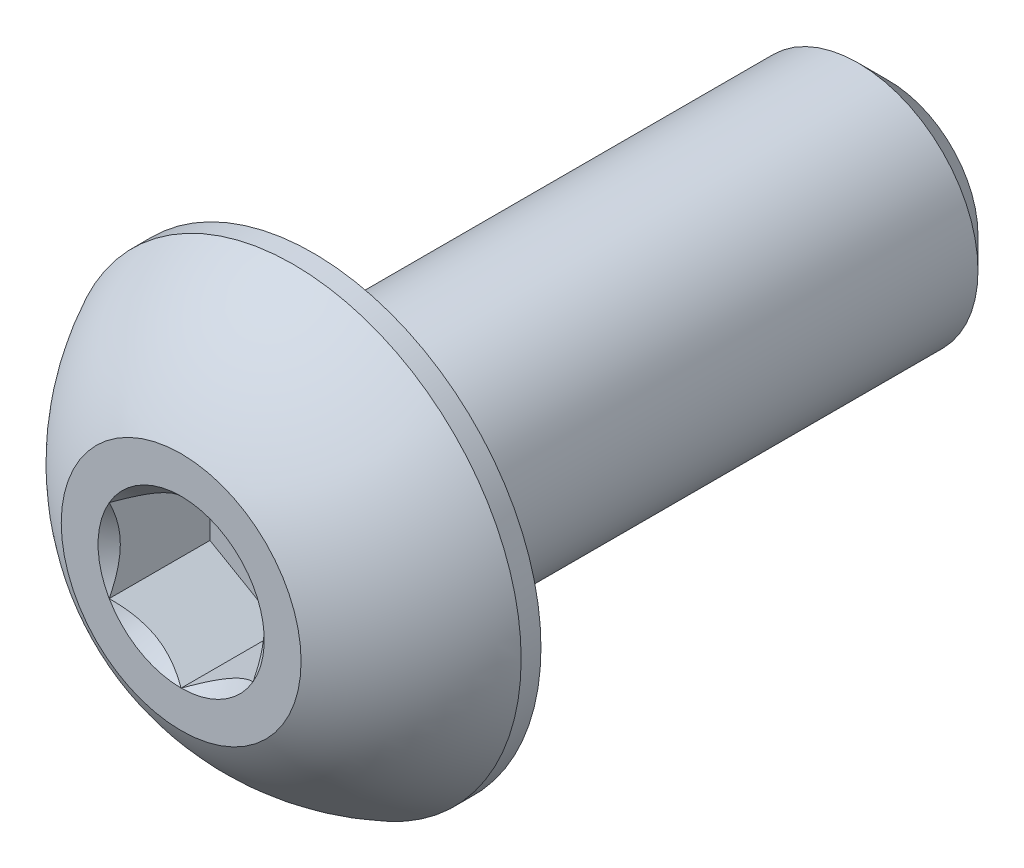
ISO-10303-21;
HEADER;
FILE_DESCRIPTION(('STEP AP214'),'2;1');
FILE_NAME('part.step','',(''),(''),'','','');
FILE_SCHEMA(('AUTOMOTIVE_DESIGN { 1 0 10303 214 1 1 1 1 }'));
ENDSEC;
DATA;
#1=APPLICATION_CONTEXT('core data for automotive mechanical design processes');
#2=APPLICATION_PROTOCOL_DEFINITION('international standard','automotive_design',2000,#1);
#3=PRODUCT_CONTEXT('',#1,'mechanical');
#4=PRODUCT('Part','Part','',(#3));
#5=PRODUCT_RELATED_PRODUCT_CATEGORY('part','',(#4));
#6=PRODUCT_DEFINITION_FORMATION('','',#4);
#7=PRODUCT_DEFINITION_CONTEXT('part definition',#1,'design');
#8=PRODUCT_DEFINITION('design','',#6,#7);
#9=PRODUCT_DEFINITION_SHAPE('','',#8);
#10=(LENGTH_UNIT() NAMED_UNIT(*) SI_UNIT(.MILLI.,.METRE.));
#11=(NAMED_UNIT(*) PLANE_ANGLE_UNIT() SI_UNIT($,.RADIAN.));
#12=(NAMED_UNIT(*) SI_UNIT($,.STERADIAN.) SOLID_ANGLE_UNIT());
#13=UNCERTAINTY_MEASURE_WITH_UNIT(LENGTH_MEASURE(1.E-05),#10,'distance_accuracy_value','');
#14=(GEOMETRIC_REPRESENTATION_CONTEXT(3) GLOBAL_UNCERTAINTY_ASSIGNED_CONTEXT((#13)) GLOBAL_UNIT_ASSIGNED_CONTEXT((#10,
#11,#12)) REPRESENTATION_CONTEXT('',''));
#15=CARTESIAN_POINT('',(0.,0.,0.));
#16=DIRECTION('',(0.,0.,1.));
#17=DIRECTION('',(1.,0.,0.));
#18=AXIS2_PLACEMENT_3D('',#15,#16,#17);
#19=CARTESIAN_POINT('',(0.,0.,7.375));
#20=DIRECTION('',(0.,0.,-1.));
#21=DIRECTION('',(-1.,0.,0.));
#22=AXIS2_PLACEMENT_3D('',#19,#20,#21);
#23=PLANE('',#22);
#24=CARTESIAN_POINT('',(0.,0.,7.375));
#25=DIRECTION('',(0.,0.,1.));
#26=DIRECTION('',(1.,0.,0.));
#27=AXIS2_PLACEMENT_3D('',#24,#25,#26);
#28=CIRCLE('',#27,1.73205080756888);
#29=CARTESIAN_POINT('',(-1.5,0.866025403784439,7.375));
#30=VERTEX_POINT('',#29);
#31=CARTESIAN_POINT('',(-1.5,-0.866025403784439,7.375));
#32=VERTEX_POINT('',#31);
#33=EDGE_CURVE('E131',#30,#32,#28,.T.);
#34=ORIENTED_EDGE('',*,*,#33,.F.);
#35=CARTESIAN_POINT('',(0.,1.73205080756888,7.375));
#36=VERTEX_POINT('',#35);
#37=EDGE_CURVE('E104',#36,#30,#28,.T.);
#38=ORIENTED_EDGE('',*,*,#37,.F.);
#39=CARTESIAN_POINT('',(1.5,0.866025403784439,7.375));
#40=VERTEX_POINT('',#39);
#41=EDGE_CURVE('E93',#40,#36,#28,.T.);
#42=ORIENTED_EDGE('',*,*,#41,.F.);
#43=CARTESIAN_POINT('',(1.5,-0.866025403784439,7.375));
#44=VERTEX_POINT('',#43);
#45=EDGE_CURVE('E57',#44,#40,#28,.T.);
#46=ORIENTED_EDGE('',*,*,#45,.F.);
#47=CARTESIAN_POINT('',(0.,-1.73205080756888,7.375));
#48=VERTEX_POINT('',#47);
#49=EDGE_CURVE('E62',#48,#44,#28,.T.);
#50=ORIENTED_EDGE('',*,*,#49,.F.);
#51=EDGE_CURVE('E135',#32,#48,#28,.T.);
#52=ORIENTED_EDGE('',*,*,#51,.F.);
#53=EDGE_LOOP('',(#34,#38,#42,#46,#50,#52));
#54=FACE_BOUND('',#53,.T.);
#55=CARTESIAN_POINT('',(0.,0.,7.375));
#56=DIRECTION('',(0.,0.,1.));
#57=DIRECTION('',(1.,0.,0.));
#58=AXIS2_PLACEMENT_3D('',#55,#56,#57);
#59=CIRCLE('',#58,2.5);
#60=CARTESIAN_POINT('',(0.,2.5,7.375));
#61=VERTEX_POINT('',#60);
#62=EDGE_CURVE('E49',#61,#61,#59,.T.);
#63=ORIENTED_EDGE('',*,*,#62,.T.);
#64=EDGE_LOOP('',(#63));
#65=FACE_BOUND('',#64,.T.);
#66=ADVANCED_FACE('F40',(#54,#65),#23,.F.);
#67=CARTESIAN_POINT('',(0.,0.,2.71694518716577));
#68=DIRECTION('',(0.,0.,1.));
#69=DIRECTION('',(0.,1.,0.));
#70=AXIS2_PLACEMENT_3D('',#67,#68,#69);
#71=SPHERICAL_SURFACE('',#70,5.28653711226622);
#72=CARTESIAN_POINT('',(0.,0.,5.0375));
#73=DIRECTION('',(0.,0.,1.));
#74=DIRECTION('',(1.,0.,0.));
#75=AXIS2_PLACEMENT_3D('',#72,#73,#74);
#76=CIRCLE('',#75,4.75);
#77=CARTESIAN_POINT('',(0.,4.75,5.0375));
#78=VERTEX_POINT('',#77);
#79=EDGE_CURVE('E211',#78,#78,#76,.T.);
#80=CARTESIAN_POINT('',(0.,2.5,7.375));
#81=CARTESIAN_POINT('',(0.,2.53026679982017,7.35875571754439));
#82=CARTESIAN_POINT('',(0.,2.56037522904968,7.34221635879359));
#83=CARTESIAN_POINT('',(0.,2.62026400427657,7.30855394811781));
#84=CARTESIAN_POINT('',(0.,2.65004435027396,7.29143089619284));
#85=CARTESIAN_POINT('',(0.,2.70926561698583,7.25660755858496));
#86=CARTESIAN_POINT('',(0.,2.73870653770032,7.23890727290205));
#87=CARTESIAN_POINT('',(0.,2.79723777417103,7.20293620595506));
#88=CARTESIAN_POINT('',(0.,2.82632808992726,7.18466542469097));
#89=CARTESIAN_POINT('',(0.,2.88414706107589,7.14756030560732));
#90=CARTESIAN_POINT('',(0.,2.91287571646831,7.12872596778776));
#91=CARTESIAN_POINT('',(0.,2.96996045130293,7.09050089302141));
#92=CARTESIAN_POINT('',(0.,2.99831653074515,7.07111015607464));
#93=CARTESIAN_POINT('',(0.,3.05464533901891,7.03177965075515));
#94=CARTESIAN_POINT('',(0.,3.08261806785047,7.01183988238243));
#95=CARTESIAN_POINT('',(0.,3.13816954607726,6.97141889083541));
#96=CARTESIAN_POINT('',(0.,3.16574829547251,6.9509376676611));
#97=CARTESIAN_POINT('',(0.,3.22050133565615,6.90944154879096));
#98=CARTESIAN_POINT('',(0.,3.24767562644455,6.88842665309514));
#99=CARTESIAN_POINT('',(0.,3.30160942393942,6.84587117426481));
#100=CARTESIAN_POINT('',(0.,3.32836893064588,6.82433059113032));
#101=CARTESIAN_POINT('',(0.,3.38146299210494,6.78073192224629));
#102=CARTESIAN_POINT('',(0.,3.40779754685753,6.75867383649675));
#103=CARTESIAN_POINT('',(0.,3.46003169800773,6.71404854384449));
#104=CARTESIAN_POINT('',(0.,3.48593129440535,6.69148133694176));
#105=CARTESIAN_POINT('',(0.,3.53728568771641,6.64584637689649));
#106=CARTESIAN_POINT('',(0.,3.56274048462986,6.62277862375395));
#107=CARTESIAN_POINT('',(0.,3.61319560685493,6.57615133633622));
#108=CARTESIAN_POINT('',(0.,3.63819593216655,6.55259180206104));
#109=CARTESIAN_POINT('',(0.,3.68773261175691,6.50498990434842));
#110=CARTESIAN_POINT('',(0.,3.71226896603565,6.48094754091097));
#111=CARTESIAN_POINT('',(0.,3.76086838042534,6.43238912030588));
#112=CARTESIAN_POINT('',(0.,3.78493144053629,6.40787306313824));
#113=CARTESIAN_POINT('',(0.,3.83257512329416,6.35837657049534));
#114=CARTESIAN_POINT('',(0.,3.85615574594108,6.33339613502008));
#115=CARTESIAN_POINT('',(0.,3.90282559378753,6.2829803776354));
#116=CARTESIAN_POINT('',(0.,3.92591481898706,6.25754505572599));
#117=CARTESIAN_POINT('',(0.,3.97159309867276,6.2062291901907));
#118=CARTESIAN_POINT('',(0.,3.99418215315894,6.18034864656483));
#119=CARTESIAN_POINT('',(0.,4.03885150820303,6.12815217148627));
#120=CARTESIAN_POINT('',(0.,4.06093180876093,6.10183624003357));
#121=CARTESIAN_POINT('',(0.,4.10457526604591,6.04877898862629));
#122=CARTESIAN_POINT('',(0.,4.12613842277298,6.0220376686717));
#123=CARTESIAN_POINT('',(0.,4.16873939899417,5.96813980122146));
#124=CARTESIAN_POINT('',(0.,4.1897772184883,5.9409832537258));
#125=CARTESIAN_POINT('',(0.,4.23131952645464,5.886265249929));
#126=CARTESIAN_POINT('',(0.,4.25182401492686,5.85870379362786));
#127=CARTESIAN_POINT('',(0.,4.29229186971308,5.8031864448106));
#128=CARTESIAN_POINT('',(0.,4.31225523602708,5.77523055229449));
#129=CARTESIAN_POINT('',(0.,4.35163326096594,5.71893495350959));
#130=CARTESIAN_POINT('',(0.,4.3710479195908,5.6905952472408));
#131=CARTESIAN_POINT('',(0.,4.40932115213664,5.63354278926291));
#132=CARTESIAN_POINT('',(0.,4.42817972605762,5.60483003755382));
#133=CARTESIAN_POINT('',(0.,4.46533362339398,5.54704239871168));
#134=CARTESIAN_POINT('',(0.,4.48362894680934,5.51796751157864));
#135=CARTESIAN_POINT('',(0.,4.51964939166499,5.45946664966676));
#136=CARTESIAN_POINT('',(0.,4.53737451310527,5.43004067488792));
#137=CARTESIAN_POINT('',(0.,4.57224781803529,5.37084881826763));
#138=CARTESIAN_POINT('',(0.,4.58939600152503,5.34108293642618));
#139=CARTESIAN_POINT('',(0.,4.62310891815402,5.28122257765293));
#140=CARTESIAN_POINT('',(0.,4.63967365129327,5.25112810072113));
#141=CARTESIAN_POINT('',(0.,4.67221336026297,5.19062198025982));
#142=CARTESIAN_POINT('',(0.,4.68818833609342,5.16021033673031));
#143=CARTESIAN_POINT('',(0.,4.71954250823692,5.09908146319351));
#144=CARTESIAN_POINT('',(0.,4.73492170454996,5.06836423318622));
#145=CARTESIAN_POINT('',(0.,4.75,5.0375));
#146=B_SPLINE_CURVE_WITH_KNOTS('',3,(#80,#81,#82,#83,#84,#85,#86,#87,#88,#89,#90,#91,#92,#93,
#94,#95,#96,#97,#98,#99,#100,#101,#102,#103,#104,#105,#106,#107,#108,#109,#110,#111,#112,#113,
#114,#115,#116,#117,#118,#119,#120,#121,#122,#123,#124,#125,#126,#127,#128,#129,#130,#131,#132,
#133,#134,#135,#136,#137,#138,#139,#140,#141,#142,#143,#144,#145),.UNSPECIFIED.,.F.,.F.,(4,2,2,
2,2,2,2,2,2,2,2,2,2,2,2,2,2,2,2,2,2,2,2,2,2,2,2,2,2,2,2,2,4),(0.,0.10304982363783,
0.206099647275661,0.309149470913491,0.412199294551323,0.515249118189152,0.618298941826983,
0.721348765464813,0.824398589102643,0.927448412740474,1.0304982363783,1.13354806001613,
1.23659788365396,1.3396477072918,1.44269753092963,1.54574735456746,1.64879717820529,
1.75184700184312,1.85489682548095,1.95794664911878,2.06099647275661,2.16404629639444,
2.26709612003227,2.3701459436701,2.47319576730793,2.57624559094576,2.67929541458359,
2.78234523822142,2.88539506185925,2.98844488549708,3.09149470913491,3.19454453277274,
3.29759435641057),.UNSPECIFIED.);
#147=EDGE_CURVE('BSEAM219',#61,#78,#146,.T.);
#148=ORIENTED_EDGE('',*,*,#62,.F.);
#149=ORIENTED_EDGE('',*,*,#79,.T.);
#150=ORIENTED_EDGE('',*,*,#147,.T.);
#151=ORIENTED_EDGE('',*,*,#147,.F.);
#152=EDGE_LOOP('',(#148,#150,#149,#151));
#153=FACE_BOUND('',#152,.T.);
#154=ADVANCED_FACE('F219',(#153),#71,.T.);
#155=CARTESIAN_POINT('',(0.,0.,7.375));
#156=DIRECTION('',(0.,0.,1.));
#157=DIRECTION('',(1.,0.,0.));
#158=AXIS2_PLACEMENT_3D('',#155,#156,#157);
#159=CYLINDRICAL_SURFACE('',#158,4.75);
#160=ORIENTED_EDGE('',*,*,#79,.F.);
#161=EDGE_LOOP('',(#160));
#162=FACE_BOUND('',#161,.T.);
#163=CARTESIAN_POINT('',(0.,0.,4.625));
#164=DIRECTION('',(0.,0.,1.));
#165=DIRECTION('',(1.,0.,0.));
#166=AXIS2_PLACEMENT_3D('',#163,#164,#165);
#167=CIRCLE('',#166,4.75);
#168=CARTESIAN_POINT('',(4.75,0.,4.625));
#169=VERTEX_POINT('',#168);
#170=EDGE_CURVE('E214',#169,#169,#167,.T.);
#171=ORIENTED_EDGE('',*,*,#170,.T.);
#172=EDGE_LOOP('',(#171));
#173=FACE_BOUND('',#172,.T.);
#174=ADVANCED_FACE('F225',(#162,#173),#159,.T.);
#175=CARTESIAN_POINT('',(0.,2.5,4.625));
#176=DIRECTION('',(0.,0.,1.));
#177=DIRECTION('',(1.,0.,0.));
#178=AXIS2_PLACEMENT_3D('',#175,#176,#177);
#179=PLANE('',#178);
#180=ORIENTED_EDGE('',*,*,#170,.F.);
#181=EDGE_LOOP('',(#180));
#182=FACE_BOUND('',#181,.T.);
#183=CARTESIAN_POINT('',(0.,0.,4.625));
#184=DIRECTION('',(0.,0.,1.));
#185=DIRECTION('',(1.,0.,0.));
#186=AXIS2_PLACEMENT_3D('',#183,#184,#185);
#187=CIRCLE('',#186,2.5);
#188=CARTESIAN_POINT('',(2.5,0.,4.625));
#189=VERTEX_POINT('',#188);
#190=EDGE_CURVE('E209',#189,#189,#187,.T.);
#191=ORIENTED_EDGE('',*,*,#190,.T.);
#192=EDGE_LOOP('',(#191));
#193=FACE_BOUND('',#192,.T.);
#194=ADVANCED_FACE('F226',(#182,#193),#179,.F.);
#195=CARTESIAN_POINT('',(0.,0.,7.375));
#196=DIRECTION('',(0.,0.,1.));
#197=DIRECTION('',(1.,0.,0.));
#198=AXIS2_PLACEMENT_3D('',#195,#196,#197);
#199=CYLINDRICAL_SURFACE('',#198,2.5);
#200=ORIENTED_EDGE('',*,*,#190,.F.);
#201=EDGE_LOOP('',(#200));
#202=FACE_BOUND('',#201,.T.);
#203=CARTESIAN_POINT('',(0.,0.,-6.735));
#204=DIRECTION('',(0.,0.,1.));
#205=DIRECTION('',(1.,0.,0.));
#206=AXIS2_PLACEMENT_3D('',#203,#204,#205);
#207=CIRCLE('',#206,2.5);
#208=CARTESIAN_POINT('',(2.5,0.,-6.735));
#209=VERTEX_POINT('',#208);
#210=EDGE_CURVE('E207',#209,#209,#207,.T.);
#211=ORIENTED_EDGE('',*,*,#210,.T.);
#212=EDGE_LOOP('',(#211));
#213=FACE_BOUND('',#212,.T.);
#214=ADVANCED_FACE('F234',(#202,#213),#199,.T.);
#215=CARTESIAN_POINT('',(0.,0.,-7.375));
#216=DIRECTION('',(0.,0.,1.));
#217=DIRECTION('',(1.,0.,0.));
#218=AXIS2_PLACEMENT_3D('',#215,#216,#217);
#219=CONICAL_SURFACE('',#218,1.86000000000001,0.785398163397442);
#220=ORIENTED_EDGE('',*,*,#210,.F.);
#221=EDGE_LOOP('',(#220));
#222=FACE_BOUND('',#221,.T.);
#223=CARTESIAN_POINT('',(0.,0.,-7.375));
#224=DIRECTION('',(0.,0.,1.));
#225=DIRECTION('',(1.,0.,0.));
#226=AXIS2_PLACEMENT_3D('',#223,#224,#225);
#227=CIRCLE('',#226,1.86000000000001);
#228=CARTESIAN_POINT('',(1.86000000000001,0.,-7.375));
#229=VERTEX_POINT('',#228);
#230=EDGE_CURVE('E192',#229,#229,#227,.T.);
#231=ORIENTED_EDGE('',*,*,#230,.T.);
#232=EDGE_LOOP('',(#231));
#233=FACE_BOUND('',#232,.T.);
#234=ADVANCED_FACE('F239',(#222,#233),#219,.T.);
#235=CARTESIAN_POINT('',(0.,0.,-7.375));
#236=DIRECTION('',(0.,0.,1.));
#237=DIRECTION('',(1.,0.,0.));
#238=AXIS2_PLACEMENT_3D('',#235,#236,#237);
#239=PLANE('',#238);
#240=ORIENTED_EDGE('',*,*,#230,.F.);
#241=EDGE_LOOP('',(#240));
#242=FACE_BOUND('',#241,.T.);
#243=ADVANCED_FACE('F168',(#242),#239,.F.);
#244=CARTESIAN_POINT('',(0.,0.,7.375));
#245=DIRECTION('',(0.,0.,1.));
#246=DIRECTION('',(1.,0.,0.));
#247=AXIS2_PLACEMENT_3D('',#244,#245,#246);
#248=CONICAL_SURFACE('',#247,1.73205080756888,0.78539816339745);
#249=ORIENTED_EDGE('',*,*,#37,.T.);
#250=CARTESIAN_POINT('',(0.000199999999999762,1.73216627762272,7.37511548160007));
#251=CARTESIAN_POINT('',(-0.0513677907370759,1.70239359975915,7.34536547606733));
#252=CARTESIAN_POINT('',(-0.103797917665201,1.67212305186355,7.31736248391031));
#253=CARTESIAN_POINT('',(-0.210709034055597,1.61039789003619,7.26608923044014));
#254=CARTESIAN_POINT('',(-0.265200195814661,1.57893740312614,7.24284750504437));
#255=CARTESIAN_POINT('',(-0.375079081357249,1.51549879897987,7.20303372899222));
#256=CARTESIAN_POINT('',(-0.4304388090952,1.4835368452681,7.1863615856709));
#257=CARTESIAN_POINT('',(-0.542377257477151,1.41890915196211,7.1606744568181));
#258=CARTESIAN_POINT('',(-0.598952556553009,1.38624538781118,7.15164029047887));
#259=CARTESIAN_POINT('',(-0.696455389516441,1.329952100953,7.14348908122685));
#260=CARTESIAN_POINT('',(-0.737256908280466,1.30639533311124,7.14228225298922));
#261=CARTESIAN_POINT('',(-0.818787969615858,1.25932335290194,7.14431405716227));
#262=CARTESIAN_POINT('',(-0.85951749431463,1.23580815085313,7.14755367074831));
#263=CARTESIAN_POINT('',(-0.940584402163416,1.18900414978427,7.15829198598196));
#264=CARTESIAN_POINT('',(-0.980921384598288,1.1657155821172,7.16579465301873));
#265=CARTESIAN_POINT('',(-1.06091833691403,1.11952932016335,7.18465161192829));
#266=CARTESIAN_POINT('',(-1.10057800851621,1.09663179808786,7.19600755701858));
#267=CARTESIAN_POINT('',(-1.20216313477448,1.03798159809698,7.22972164759267));
#268=CARTESIAN_POINT('',(-1.26345855370969,1.00259267147465,7.25462184909337));
#269=CARTESIAN_POINT('',(-1.35358562846331,0.950557780604375,7.29665665327158));
#270=CARTESIAN_POINT('',(-1.38328513990772,0.933410759677148,7.3114251535591));
#271=CARTESIAN_POINT('',(-1.44213790138375,0.899432101996407,7.34231056594017));
#272=CARTESIAN_POINT('',(-1.47129140422064,0.882600319285711,7.35842683412171));
#273=CARTESIAN_POINT('',(-1.5002,0.865909933730602,7.37511548160007));
#274=B_SPLINE_CURVE_WITH_KNOTS('',3,(#250,#251,#252,#253,#254,#255,#256,#257,#258,#259,#260,
#261,#262,#263,#264,#265,#266,#267,#268,#269,#270,#271,#272,#273),.UNSPECIFIED.,.F.,.F.,(4,2,2,
2,2,2,2,2,2,2,2,4),(0.,0.199829143693305,0.400822987382388,0.59862372053818,0.795926240188888,
0.93711306795988,1.07833105577193,1.21968061668222,1.36109089931054,1.58570969637565,
1.69770705470964,1.80965120737194),.UNSPECIFIED.);
#275=EDGE_CURVE('E11',#36,#30,#274,.T.);
#276=ORIENTED_EDGE('',*,*,#275,.F.);
#277=EDGE_LOOP('',(#249,#276));
#278=FACE_BOUND('',#277,.T.);
#279=ADVANCED_FACE('F108',(#278),#248,.F.);
#280=ORIENTED_EDGE('',*,*,#33,.T.);
#281=CARTESIAN_POINT('',(-1.5,-1.72720812969692,7.93057851627079));
#282=CARTESIAN_POINT('',(-1.5,-1.68515175699268,7.89882990785743));
#283=CARTESIAN_POINT('',(-1.5,-1.64286104748673,7.86739259380738));
#284=CARTESIAN_POINT('',(-1.5,-1.55771581035942,7.80526908755641));
#285=CARTESIAN_POINT('',(-1.5,-1.51486114386668,7.7745830858922));
#286=CARTESIAN_POINT('',(-1.5,-1.3846813415127,7.68340719242716));
#287=CARTESIAN_POINT('',(-1.5,-1.29637976071654,7.62428834342677));
#288=CARTESIAN_POINT('',(-1.5,-1.11121478730467,7.5082309963165));
#289=CARTESIAN_POINT('',(-1.5,-1.01415038238167,7.45160955873301));
#290=CARTESIAN_POINT('',(-1.5,-0.815173408897604,7.34803688126565));
#291=CARTESIAN_POINT('',(-1.5,-0.713278669253284,7.30105304154167));
#292=CARTESIAN_POINT('',(-1.5,-0.560333774943111,7.24357266843083));
#293=CARTESIAN_POINT('',(-1.5,-0.511547982948042,7.22707538775725));
#294=CARTESIAN_POINT('',(-1.5,-0.412798620136866,7.197997512927));
#295=CARTESIAN_POINT('',(-1.5,-0.362834968437562,7.18541718859402));
#296=CARTESIAN_POINT('',(-1.5,-0.262863235444981,7.16503619414677));
#297=CARTESIAN_POINT('',(-1.5,-0.212872113808022,7.15715363274598));
#298=CARTESIAN_POINT('',(-1.5,-0.112355243569545,7.146322063969));
#299=CARTESIAN_POINT('',(-1.5,-0.0618295883726273,7.14337220852435));
#300=CARTESIAN_POINT('',(-1.5,0.0374291733323844,7.14262485772485));
#301=CARTESIAN_POINT('',(-1.5,0.0861609672002992,7.14464473355808));
#302=CARTESIAN_POINT('',(-1.5,0.183206937768827,7.15332255289676));
#303=CARTESIAN_POINT('',(-1.5,0.231521073438269,7.15998094696846));
#304=CARTESIAN_POINT('',(-1.5,0.328199853425436,7.17768524412257));
#305=CARTESIAN_POINT('',(-1.5,0.376550616310328,7.18880581125704));
#306=CARTESIAN_POINT('',(-1.5,0.472195697125598,7.21484341404871));
#307=CARTESIAN_POINT('',(-1.5,0.519490103092741,7.22976013204093));
#308=CARTESIAN_POINT('',(-1.5,0.668391282696625,7.28233522359607));
#309=CARTESIAN_POINT('',(-1.5,0.767878709508553,7.32598128747197));
#310=CARTESIAN_POINT('',(-1.5,0.962179866690724,7.4230229945931));
#311=CARTESIAN_POINT('',(-1.5,1.05697519961444,7.47645366508953));
#312=CARTESIAN_POINT('',(-1.5,1.23814273533383,7.58668585200456));
#313=CARTESIAN_POINT('',(-1.5,1.3246994218129,7.6431879206986));
#314=CARTESIAN_POINT('',(-1.5,1.45222331290673,7.73053430157866));
#315=CARTESIAN_POINT('',(-1.5,1.49418091978756,7.75995775868004));
#316=CARTESIAN_POINT('',(-1.5,1.57752272931476,7.81958282183046));
#317=CARTESIAN_POINT('',(-1.5,1.61890708647354,7.84978421166444));
#318=CARTESIAN_POINT('',(-1.5,1.66005278019494,7.88030817860946));
#319=B_SPLINE_CURVE_WITH_KNOTS('',3,(#281,#282,#283,#284,#285,#286,#287,#288,#289,#290,#291,
#292,#293,#294,#295,#296,#297,#298,#299,#300,#301,#302,#303,#304,#305,#306,#307,#308,#309,#310,
#311,#312,#313,#314,#315,#316,#317,#318),.UNSPECIFIED.,.F.,.F.,(4,2,2,2,2,2,2,2,2,2,2,2,2,2,2,2,
2,2,4),(0.,0.158079548982668,0.316198780993942,0.634850417346958,0.971690311361511,
1.30737131660667,1.46173961127089,1.61611853740677,1.7677210142141,1.91929742368538,
2.065387412096,2.21149159305544,2.36014984633872,2.50879566386709,2.83376031422673,
3.15991186985652,3.46985601802197,3.62358896039974,3.7772796264207),.UNSPECIFIED.);
#320=EDGE_CURVE('E101',#30,#32,#319,.F.);
#321=ORIENTED_EDGE('',*,*,#320,.F.);
#322=EDGE_LOOP('',(#280,#321));
#323=FACE_BOUND('',#322,.T.);
#324=ADVANCED_FACE('F254',(#323),#248,.F.);
#325=ORIENTED_EDGE('',*,*,#51,.T.);
#326=CARTESIAN_POINT('',(-1.5002,-0.865909933730601,7.37511548160007));
#327=CARTESIAN_POINT('',(-1.44863220926292,-0.895682611594166,7.34536547606733));
#328=CARTESIAN_POINT('',(-1.3962020823348,-0.925953159489765,7.31736248391031));
#329=CARTESIAN_POINT('',(-1.2892909659444,-0.987678321317123,7.26608923044014));
#330=CARTESIAN_POINT('',(-1.23479980418534,-1.01913880822717,7.24284750504437));
#331=CARTESIAN_POINT('',(-1.12492091864275,-1.08257741237344,7.20303372899222));
#332=CARTESIAN_POINT('',(-1.0695611909048,-1.11453936608521,7.18636158567089));
#333=CARTESIAN_POINT('',(-0.957622742522849,-1.1791670593912,7.1606744568181));
#334=CARTESIAN_POINT('',(-0.901047443446991,-1.21183082354213,7.15164029047886));
#335=CARTESIAN_POINT('',(-0.803544610483559,-1.26812411040032,7.14348908122685));
#336=CARTESIAN_POINT('',(-0.762743091719534,-1.29168087824208,7.14228225298922));
#337=CARTESIAN_POINT('',(-0.681212030384142,-1.33875285845138,7.14431405716227));
#338=CARTESIAN_POINT('',(-0.64048250568537,-1.36226806050018,7.14755367074831));
#339=CARTESIAN_POINT('',(-0.559415597836584,-1.40907206156905,7.15829198598196));
#340=CARTESIAN_POINT('',(-0.519078615401712,-1.43236062923612,7.16579465301873));
#341=CARTESIAN_POINT('',(-0.439081663085969,-1.47854689118996,7.18465161192829));
#342=CARTESIAN_POINT('',(-0.399421991483792,-1.50144441326545,7.19600755701858));
#343=CARTESIAN_POINT('',(-0.297836865225515,-1.56009461325633,7.22972164759267));
#344=CARTESIAN_POINT('',(-0.236541446290311,-1.59548353987866,7.25462184909337));
#345=CARTESIAN_POINT('',(-0.146414371536686,-1.64751843074894,7.29665665327158));
#346=CARTESIAN_POINT('',(-0.116714860092282,-1.66466545167617,7.3114251535591));
#347=CARTESIAN_POINT('',(-0.057862098616249,-1.69864410935691,7.34231056594017));
#348=CARTESIAN_POINT('',(-0.0287085957793628,-1.71547589206761,7.35842683412171));
#349=CARTESIAN_POINT('',(0.000199999999999948,-1.73216627762272,7.37511548160007));
#350=B_SPLINE_CURVE_WITH_KNOTS('',3,(#326,#327,#328,#329,#330,#331,#332,#333,#334,#335,#336,
#337,#338,#339,#340,#341,#342,#343,#344,#345,#346,#347,#348,#349),.UNSPECIFIED.,.F.,.F.,(4,2,2,
2,2,2,2,2,2,2,2,4),(0.,0.199829143693305,0.400822987382388,0.598623720538181,0.795926240188889,
0.937113067959881,1.07833105577193,1.21968061668222,1.36109089931054,1.58570969637565,
1.69770705470964,1.80965120737194),.UNSPECIFIED.);
#351=EDGE_CURVE('E145',#32,#48,#350,.T.);
#352=ORIENTED_EDGE('',*,*,#351,.F.);
#353=EDGE_LOOP('',(#325,#352));
#354=FACE_BOUND('',#353,.T.);
#355=ADVANCED_FACE('F268',(#354),#248,.F.);
#356=ORIENTED_EDGE('',*,*,#49,.T.);
#357=CARTESIAN_POINT('',(-0.000200000000000055,-1.73216627762271,7.37511548160007));
#358=CARTESIAN_POINT('',(0.0513677907370755,-1.70239359975915,7.34536547606733));
#359=CARTESIAN_POINT('',(0.103797917665201,-1.67212305186355,7.31736248391031));
#360=CARTESIAN_POINT('',(0.210709034055597,-1.61039789003619,7.26608923044014));
#361=CARTESIAN_POINT('',(0.265200195814661,-1.57893740312614,7.24284750504437));
#362=CARTESIAN_POINT('',(0.375079081357248,-1.51549879897987,7.20303372899222));
#363=CARTESIAN_POINT('',(0.430438809095199,-1.4835368452681,7.18636158567089));
#364=CARTESIAN_POINT('',(0.54237725747715,-1.41890915196211,7.1606744568181));
#365=CARTESIAN_POINT('',(0.598952556553008,-1.38624538781118,7.15164029047886));
#366=CARTESIAN_POINT('',(0.69645538951644,-1.32995210095299,7.14348908122685));
#367=CARTESIAN_POINT('',(0.737256908280466,-1.30639533311124,7.14228225298922));
#368=CARTESIAN_POINT('',(0.818787969615858,-1.25932335290193,7.14431405716227));
#369=CARTESIAN_POINT('',(0.859517494314629,-1.23580815085313,7.14755367074831));
#370=CARTESIAN_POINT('',(0.940584402163416,-1.18900414978427,7.15829198598196));
#371=CARTESIAN_POINT('',(0.980921384598288,-1.1657155821172,7.16579465301873));
#372=CARTESIAN_POINT('',(1.06091833691403,-1.11952932016335,7.18465161192829));
#373=CARTESIAN_POINT('',(1.10057800851621,-1.09663179808786,7.19600755701858));
#374=CARTESIAN_POINT('',(1.20216313477448,-1.03798159809698,7.22972164759267));
#375=CARTESIAN_POINT('',(1.26345855370969,-1.00259267147465,7.25462184909337));
#376=CARTESIAN_POINT('',(1.35358562846331,-0.950557780604375,7.29665665327158));
#377=CARTESIAN_POINT('',(1.38328513990772,-0.933410759677148,7.3114251535591));
#378=CARTESIAN_POINT('',(1.44213790138375,-0.899432101996407,7.34231056594017));
#379=CARTESIAN_POINT('',(1.47129140422064,-0.88260031928571,7.35842683412171));
#380=CARTESIAN_POINT('',(1.5002,-0.865909933730601,7.37511548160007));
#381=B_SPLINE_CURVE_WITH_KNOTS('',3,(#357,#358,#359,#360,#361,#362,#363,#364,#365,#366,#367,
#368,#369,#370,#371,#372,#373,#374,#375,#376,#377,#378,#379,#380),.UNSPECIFIED.,.F.,.F.,(4,2,2,
2,2,2,2,2,2,2,2,4),(0.,0.199829143693305,0.400822987382388,0.59862372053818,0.795926240188889,
0.93711306795988,1.07833105577193,1.21968061668222,1.36109089931054,1.58570969637565,
1.69770705470963,1.80965120737194),.UNSPECIFIED.);
#382=EDGE_CURVE('E349',#48,#44,#381,.T.);
#383=ORIENTED_EDGE('',*,*,#382,.F.);
#384=EDGE_LOOP('',(#356,#383));
#385=FACE_BOUND('',#384,.T.);
#386=ADVANCED_FACE('F279',(#385),#248,.F.);
#387=ORIENTED_EDGE('',*,*,#45,.T.);
#388=CARTESIAN_POINT('',(1.5,-1.72720812969693,7.93057851627079));
#389=CARTESIAN_POINT('',(1.5,-1.68515175699268,7.89882990785743));
#390=CARTESIAN_POINT('',(1.5,-1.64286104748674,7.86739259380738));
#391=CARTESIAN_POINT('',(1.5,-1.55771581035942,7.80526908755641));
#392=CARTESIAN_POINT('',(1.5,-1.51486114386668,7.7745830858922));
#393=CARTESIAN_POINT('',(1.5,-1.3846813415127,7.68340719242716));
#394=CARTESIAN_POINT('',(1.5,-1.29637976071654,7.62428834342677));
#395=CARTESIAN_POINT('',(1.5,-1.11121478730467,7.5082309963165));
#396=CARTESIAN_POINT('',(1.5,-1.01415038238167,7.45160955873301));
#397=CARTESIAN_POINT('',(1.5,-0.815173408897606,7.34803688126565));
#398=CARTESIAN_POINT('',(1.5,-0.713278669253286,7.30105304154167));
#399=CARTESIAN_POINT('',(1.5,-0.560333774943112,7.24357266843083));
#400=CARTESIAN_POINT('',(1.5,-0.511547982948042,7.22707538775725));
#401=CARTESIAN_POINT('',(1.5,-0.412798620136867,7.197997512927));
#402=CARTESIAN_POINT('',(1.5,-0.362834968437563,7.18541718859402));
#403=CARTESIAN_POINT('',(1.5,-0.262863235444982,7.16503619414677));
#404=CARTESIAN_POINT('',(1.5,-0.212872113808023,7.15715363274598));
#405=CARTESIAN_POINT('',(1.5,-0.112355243569545,7.146322063969));
#406=CARTESIAN_POINT('',(1.5,-0.061829588372628,7.14337220852435));
#407=CARTESIAN_POINT('',(1.5,0.037429173332384,7.14262485772485));
#408=CARTESIAN_POINT('',(1.5,0.0861609672002989,7.14464473355807));
#409=CARTESIAN_POINT('',(1.5,0.183206937768827,7.15332255289676));
#410=CARTESIAN_POINT('',(1.5,0.231521073438269,7.15998094696846));
#411=CARTESIAN_POINT('',(1.5,0.328199853425436,7.17768524412257));
#412=CARTESIAN_POINT('',(1.5,0.376550616310328,7.18880581125704));
#413=CARTESIAN_POINT('',(1.5,0.472195697125599,7.21484341404871));
#414=CARTESIAN_POINT('',(1.5,0.519490103092741,7.22976013204093));
#415=CARTESIAN_POINT('',(1.5,0.668391282696624,7.28233522359607));
#416=CARTESIAN_POINT('',(1.5,0.767878709508552,7.32598128747197));
#417=CARTESIAN_POINT('',(1.5,0.962179866690723,7.4230229945931));
#418=CARTESIAN_POINT('',(1.5,1.05697519961444,7.47645366508953));
#419=CARTESIAN_POINT('',(1.5,1.23814273533383,7.58668585200456));
#420=CARTESIAN_POINT('',(1.5,1.3246994218129,7.64318792069859));
#421=CARTESIAN_POINT('',(1.5,1.45222331290673,7.73053430157866));
#422=CARTESIAN_POINT('',(1.5,1.49418091978756,7.75995775868004));
#423=CARTESIAN_POINT('',(1.5,1.57752272931476,7.81958282183046));
#424=CARTESIAN_POINT('',(1.5,1.61890708647354,7.84978421166444));
#425=CARTESIAN_POINT('',(1.5,1.66005278019494,7.88030817860945));
#426=B_SPLINE_CURVE_WITH_KNOTS('',3,(#388,#389,#390,#391,#392,#393,#394,#395,#396,#397,#398,
#399,#400,#401,#402,#403,#404,#405,#406,#407,#408,#409,#410,#411,#412,#413,#414,#415,#416,#417,
#418,#419,#420,#421,#422,#423,#424,#425),.UNSPECIFIED.,.F.,.F.,(4,2,2,2,2,2,2,2,2,2,2,2,2,2,2,2,
2,2,4),(0.,0.158079548982668,0.316198780993942,0.634850417346959,0.97169031136151,
1.30737131660667,1.46173961127089,1.61611853740677,1.7677210142141,1.91929742368538,
2.065387412096,2.21149159305544,2.36014984633872,2.5087956638671,2.83376031422673,
3.15991186985652,3.46985601802197,3.62358896039974,3.7772796264207),.UNSPECIFIED.);
#427=EDGE_CURVE('E119',#44,#40,#426,.T.);
#428=ORIENTED_EDGE('',*,*,#427,.F.);
#429=EDGE_LOOP('',(#387,#428));
#430=FACE_BOUND('',#429,.T.);
#431=ADVANCED_FACE('F282',(#430),#248,.F.);
#432=ORIENTED_EDGE('',*,*,#41,.T.);
#433=CARTESIAN_POINT('',(1.5002,0.865909933730601,7.37511548160007));
#434=CARTESIAN_POINT('',(1.44863220926292,0.895682611594166,7.34536547606733));
#435=CARTESIAN_POINT('',(1.3962020823348,0.925953159489765,7.31736248391031));
#436=CARTESIAN_POINT('',(1.2892909659444,0.987678321317124,7.26608923044014));
#437=CARTESIAN_POINT('',(1.23479980418534,1.01913880822718,7.24284750504437));
#438=CARTESIAN_POINT('',(1.12492091864275,1.08257741237344,7.20303372899222));
#439=CARTESIAN_POINT('',(1.0695611909048,1.11453936608521,7.1863615856709));
#440=CARTESIAN_POINT('',(0.957622742522849,1.1791670593912,7.1606744568181));
#441=CARTESIAN_POINT('',(0.901047443446991,1.21183082354213,7.15164029047887));
#442=CARTESIAN_POINT('',(0.803544610483559,1.26812411040032,7.14348908122685));
#443=CARTESIAN_POINT('',(0.762743091719533,1.29168087824208,7.14228225298922));
#444=CARTESIAN_POINT('',(0.681212030384141,1.33875285845138,7.14431405716227));
#445=CARTESIAN_POINT('',(0.64048250568537,1.36226806050018,7.14755367074831));
#446=CARTESIAN_POINT('',(0.559415597836584,1.40907206156905,7.15829198598196));
#447=CARTESIAN_POINT('',(0.519078615401711,1.43236062923612,7.16579465301873));
#448=CARTESIAN_POINT('',(0.439081663085969,1.47854689118996,7.18465161192829));
#449=CARTESIAN_POINT('',(0.399421991483792,1.50144441326545,7.19600755701858));
#450=CARTESIAN_POINT('',(0.297836865225515,1.56009461325633,7.22972164759267));
#451=CARTESIAN_POINT('',(0.236541446290311,1.59548353987866,7.25462184909337));
#452=CARTESIAN_POINT('',(0.146414371536686,1.64751843074894,7.29665665327158));
#453=CARTESIAN_POINT('',(0.116714860092282,1.66466545167617,7.3114251535591));
#454=CARTESIAN_POINT('',(0.0578620986162487,1.69864410935691,7.34231056594017));
#455=CARTESIAN_POINT('',(0.0287085957793624,1.71547589206761,7.35842683412171));
#456=CARTESIAN_POINT('',(-0.000200000000000159,1.73216627762272,7.37511548160007));
#457=B_SPLINE_CURVE_WITH_KNOTS('',3,(#433,#434,#435,#436,#437,#438,#439,#440,#441,#442,#443,
#444,#445,#446,#447,#448,#449,#450,#451,#452,#453,#454,#455,#456),.UNSPECIFIED.,.F.,.F.,(4,2,2,
2,2,2,2,2,2,2,2,4),(0.,0.199829143693305,0.400822987382389,0.598623720538181,0.795926240188889,
0.937113067959882,1.07833105577193,1.21968061668222,1.36109089931054,1.58570969637565,
1.69770705470964,1.80965120737194),.UNSPECIFIED.);
#458=EDGE_CURVE('E100',#40,#36,#457,.T.);
#459=ORIENTED_EDGE('',*,*,#458,.F.);
#460=EDGE_LOOP('',(#432,#459));
#461=FACE_BOUND('',#460,.T.);
#462=ADVANCED_FACE('F97',(#461),#248,.F.);
#463=CARTESIAN_POINT('',(0.,0.,5.275));
#464=DIRECTION('',(0.,0.,1.));
#465=DIRECTION('',(1.,0.,0.));
#466=AXIS2_PLACEMENT_3D('',#463,#464,#465);
#467=PLANE('',#466);
#468=DIRECTION('',(-0.866025403784439,0.5,0.));
#469=VECTOR('',#468,1.);
#470=CARTESIAN_POINT('',(1.5,0.866025403784439,5.275));
#471=LINE('',#470,#469);
#472=CARTESIAN_POINT('',(1.5,0.866025403784439,5.275));
#473=VERTEX_POINT('',#472);
#474=CARTESIAN_POINT('',(0.,1.73205080756888,5.275));
#475=VERTEX_POINT('',#474);
#476=EDGE_CURVE('E118',#473,#475,#471,.T.);
#477=ORIENTED_EDGE('',*,*,#476,.T.);
#478=DIRECTION('',(-0.866025403784439,-0.5,0.));
#479=VECTOR('',#478,1.);
#480=CARTESIAN_POINT('',(0.,1.73205080756888,5.275));
#481=LINE('',#480,#479);
#482=CARTESIAN_POINT('',(-1.5,0.866025403784439,5.275));
#483=VERTEX_POINT('',#482);
#484=EDGE_CURVE('E121',#475,#483,#481,.T.);
#485=ORIENTED_EDGE('',*,*,#484,.T.);
#486=DIRECTION('',(0.,-1.,0.));
#487=VECTOR('',#486,1.);
#488=CARTESIAN_POINT('',(-1.5,0.866025403784439,5.275));
#489=LINE('',#488,#487);
#490=CARTESIAN_POINT('',(-1.5,-0.866025403784438,5.275));
#491=VERTEX_POINT('',#490);
#492=EDGE_CURVE('E181',#483,#491,#489,.T.);
#493=ORIENTED_EDGE('',*,*,#492,.T.);
#494=DIRECTION('',(0.866025403784439,-0.5,0.));
#495=VECTOR('',#494,1.);
#496=CARTESIAN_POINT('',(-1.5,-0.866025403784438,5.275));
#497=LINE('',#496,#495);
#498=CARTESIAN_POINT('',(0.,-1.73205080756888,5.275));
#499=VERTEX_POINT('',#498);
#500=EDGE_CURVE('E183',#491,#499,#497,.T.);
#501=ORIENTED_EDGE('',*,*,#500,.T.);
#502=DIRECTION('',(0.866025403784439,0.5,0.));
#503=VECTOR('',#502,1.);
#504=CARTESIAN_POINT('',(0.,-1.73205080756888,5.275));
#505=LINE('',#504,#503);
#506=CARTESIAN_POINT('',(1.5,-0.866025403784439,5.275));
#507=VERTEX_POINT('',#506);
#508=EDGE_CURVE('E190',#499,#507,#505,.T.);
#509=ORIENTED_EDGE('',*,*,#508,.T.);
#510=DIRECTION('',(0.,1.,0.));
#511=VECTOR('',#510,1.);
#512=CARTESIAN_POINT('',(1.5,-0.866025403784439,5.275));
#513=LINE('',#512,#511);
#514=EDGE_CURVE('E129',#507,#473,#513,.T.);
#515=ORIENTED_EDGE('',*,*,#514,.T.);
#516=EDGE_LOOP('',(#477,#485,#493,#501,#509,#515));
#517=FACE_BOUND('',#516,.T.);
#518=ADVANCED_FACE('F163',(#517),#467,.T.);
#519=CARTESIAN_POINT('',(0.,1.73205080756888,5.275));
#520=DIRECTION('',(-0.5,0.866025403784439,0.));
#521=DIRECTION('',(-0.866025403784439,-0.5,0.));
#522=AXIS2_PLACEMENT_3D('',#519,#520,#521);
#523=PLANE('',#522);
#524=DIRECTION('',(0.,0.,1.));
#525=VECTOR('',#524,1.);
#526=CARTESIAN_POINT('',(0.,1.73205080756888,5.275));
#527=LINE('',#526,#525);
#528=EDGE_CURVE('E116',#475,#36,#527,.T.);
#529=ORIENTED_EDGE('',*,*,#528,.T.);
#530=ORIENTED_EDGE('',*,*,#275,.T.);
#531=DIRECTION('',(0.,0.,1.));
#532=VECTOR('',#531,1.);
#533=CARTESIAN_POINT('',(-1.5,0.866025403784439,5.275));
#534=LINE('',#533,#532);
#535=EDGE_CURVE('E128',#483,#30,#534,.T.);
#536=ORIENTED_EDGE('',*,*,#535,.F.);
#537=ORIENTED_EDGE('',*,*,#484,.F.);
#538=EDGE_LOOP('',(#529,#530,#536,#537));
#539=FACE_BOUND('',#538,.T.);
#540=ADVANCED_FACE('F125',(#539),#523,.F.);
#541=CARTESIAN_POINT('',(-1.5,0.866025403784439,5.275));
#542=DIRECTION('',(-1.,0.,0.));
#543=DIRECTION('',(0.,0.,1.));
#544=AXIS2_PLACEMENT_3D('',#541,#542,#543);
#545=PLANE('',#544);
#546=ORIENTED_EDGE('',*,*,#535,.T.);
#547=ORIENTED_EDGE('',*,*,#320,.T.);
#548=DIRECTION('',(0.,0.,1.));
#549=VECTOR('',#548,1.);
#550=CARTESIAN_POINT('',(-1.5,-0.866025403784438,5.275));
#551=LINE('',#550,#549);
#552=EDGE_CURVE('E197',#491,#32,#551,.T.);
#553=ORIENTED_EDGE('',*,*,#552,.F.);
#554=ORIENTED_EDGE('',*,*,#492,.F.);
#555=EDGE_LOOP('',(#546,#547,#553,#554));
#556=FACE_BOUND('',#555,.T.);
#557=ADVANCED_FACE('F151',(#556),#545,.F.);
#558=CARTESIAN_POINT('',(-1.5,-0.866025403784438,5.275));
#559=DIRECTION('',(-0.5,-0.866025403784439,0.));
#560=DIRECTION('',(0.866025403784439,-0.5,0.));
#561=AXIS2_PLACEMENT_3D('',#558,#559,#560);
#562=PLANE('',#561);
#563=ORIENTED_EDGE('',*,*,#552,.T.);
#564=ORIENTED_EDGE('',*,*,#351,.T.);
#565=DIRECTION('',(0.,0.,1.));
#566=VECTOR('',#565,1.);
#567=CARTESIAN_POINT('',(0.,-1.73205080756888,5.275));
#568=LINE('',#567,#566);
#569=EDGE_CURVE('E196',#499,#48,#568,.T.);
#570=ORIENTED_EDGE('',*,*,#569,.F.);
#571=ORIENTED_EDGE('',*,*,#500,.F.);
#572=EDGE_LOOP('',(#563,#564,#570,#571));
#573=FACE_BOUND('',#572,.T.);
#574=ADVANCED_FACE('F152',(#573),#562,.F.);
#575=CARTESIAN_POINT('',(0.,-1.73205080756888,5.275));
#576=DIRECTION('',(0.5,-0.866025403784439,0.));
#577=DIRECTION('',(0.866025403784439,0.5,0.));
#578=AXIS2_PLACEMENT_3D('',#575,#576,#577);
#579=PLANE('',#578);
#580=ORIENTED_EDGE('',*,*,#569,.T.);
#581=ORIENTED_EDGE('',*,*,#382,.T.);
#582=DIRECTION('',(0.,0.,1.));
#583=VECTOR('',#582,1.);
#584=CARTESIAN_POINT('',(1.5,-0.866025403784439,5.275));
#585=LINE('',#584,#583);
#586=EDGE_CURVE('E195',#507,#44,#585,.T.);
#587=ORIENTED_EDGE('',*,*,#586,.F.);
#588=ORIENTED_EDGE('',*,*,#508,.F.);
#589=EDGE_LOOP('',(#580,#581,#587,#588));
#590=FACE_BOUND('',#589,.T.);
#591=ADVANCED_FACE('F308',(#590),#579,.F.);
#592=CARTESIAN_POINT('',(1.5,-0.866025403784439,5.275));
#593=DIRECTION('',(1.,0.,0.));
#594=DIRECTION('',(0.,1.,0.));
#595=AXIS2_PLACEMENT_3D('',#592,#593,#594);
#596=PLANE('',#595);
#597=ORIENTED_EDGE('',*,*,#586,.T.);
#598=ORIENTED_EDGE('',*,*,#427,.T.);
#599=DIRECTION('',(0.,0.,1.));
#600=VECTOR('',#599,1.);
#601=CARTESIAN_POINT('',(1.5,0.866025403784439,5.275));
#602=LINE('',#601,#600);
#603=EDGE_CURVE('E117',#473,#40,#602,.T.);
#604=ORIENTED_EDGE('',*,*,#603,.F.);
#605=ORIENTED_EDGE('',*,*,#514,.F.);
#606=EDGE_LOOP('',(#597,#598,#604,#605));
#607=FACE_BOUND('',#606,.T.);
#608=ADVANCED_FACE('F164',(#607),#596,.F.);
#609=CARTESIAN_POINT('',(1.5,0.866025403784439,5.275));
#610=DIRECTION('',(0.5,0.866025403784439,0.));
#611=DIRECTION('',(-0.866025403784439,0.5,0.));
#612=AXIS2_PLACEMENT_3D('',#609,#610,#611);
#613=PLANE('',#612);
#614=ORIENTED_EDGE('',*,*,#603,.T.);
#615=ORIENTED_EDGE('',*,*,#458,.T.);
#616=ORIENTED_EDGE('',*,*,#528,.F.);
#617=ORIENTED_EDGE('',*,*,#476,.F.);
#618=EDGE_LOOP('',(#614,#615,#616,#617));
#619=FACE_BOUND('',#618,.T.);
#620=ADVANCED_FACE('F112',(#619),#613,.F.);
#621=CLOSED_SHELL('',(#66,#154,#174,#194,#214,#234,#243,#279,#324,#355,#386,#431,#462,#518,#540,
#557,#574,#591,#608,#620));
#622=MANIFOLD_SOLID_BREP('B2',#621);
#623=ADVANCED_BREP_SHAPE_REPRESENTATION('',(#18,#622),#14);
#624=SHAPE_DEFINITION_REPRESENTATION(#9,#623);
ENDSEC;
END-ISO-10303-21;
